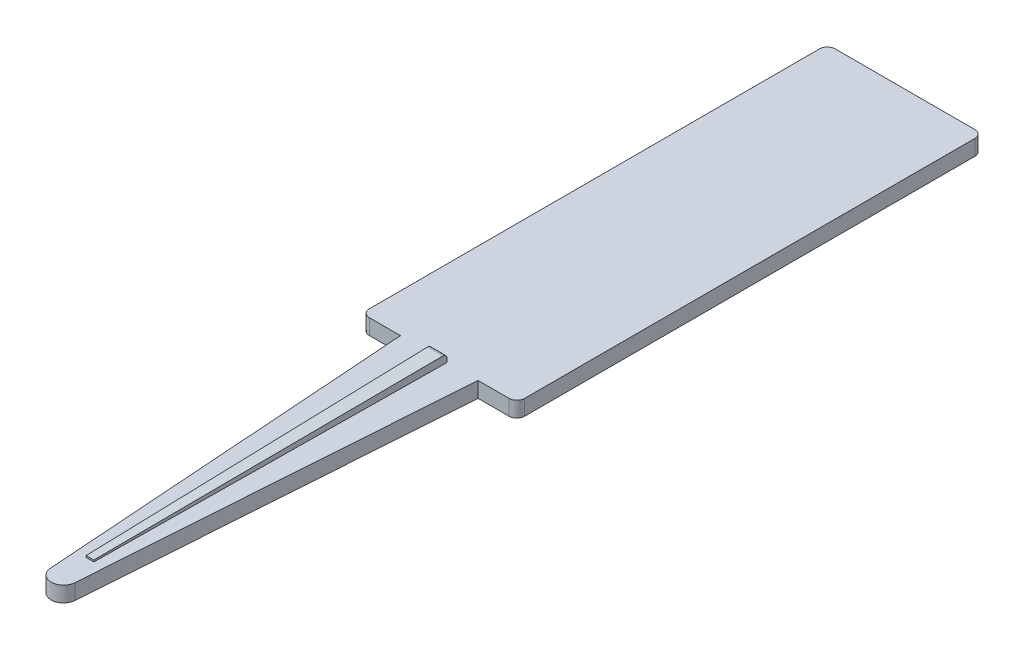
ISO-10303-21;
HEADER;
FILE_DESCRIPTION(('STEP AP214'),'2;1');
FILE_NAME('part.step','',(''),(''),'','','');
FILE_SCHEMA(('AUTOMOTIVE_DESIGN { 1 0 10303 214 1 1 1 1 }'));
ENDSEC;
DATA;
#1=APPLICATION_CONTEXT('core data for automotive mechanical design processes');
#2=APPLICATION_PROTOCOL_DEFINITION('international standard','automotive_design',2000,#1);
#3=PRODUCT_CONTEXT('',#1,'mechanical');
#4=PRODUCT('Part','Part','',(#3));
#5=PRODUCT_RELATED_PRODUCT_CATEGORY('part','',(#4));
#6=PRODUCT_DEFINITION_FORMATION('','',#4);
#7=PRODUCT_DEFINITION_CONTEXT('part definition',#1,'design');
#8=PRODUCT_DEFINITION('design','',#6,#7);
#9=PRODUCT_DEFINITION_SHAPE('','',#8);
#10=(LENGTH_UNIT() NAMED_UNIT(*) SI_UNIT(.MILLI.,.METRE.));
#11=(NAMED_UNIT(*) PLANE_ANGLE_UNIT() SI_UNIT($,.RADIAN.));
#12=(NAMED_UNIT(*) SI_UNIT($,.STERADIAN.) SOLID_ANGLE_UNIT());
#13=UNCERTAINTY_MEASURE_WITH_UNIT(LENGTH_MEASURE(1.E-05),#10,'distance_accuracy_value','');
#14=(GEOMETRIC_REPRESENTATION_CONTEXT(3) GLOBAL_UNCERTAINTY_ASSIGNED_CONTEXT((#13)) GLOBAL_UNIT_ASSIGNED_CONTEXT((#10,
#11,#12)) REPRESENTATION_CONTEXT('',''));
#15=CARTESIAN_POINT('',(0.,0.,0.));
#16=DIRECTION('',(0.,0.,1.));
#17=DIRECTION('',(1.,0.,0.));
#18=AXIS2_PLACEMENT_3D('',#15,#16,#17);
#19=CARTESIAN_POINT('',(11.,2.49119630351394,60.5));
#20=DIRECTION('',(-1.,0.,0.));
#21=DIRECTION('',(0.,0.,1.));
#22=AXIS2_PLACEMENT_3D('',#19,#20,#21);
#23=CYLINDRICAL_SURFACE('',#22,0.5);
#24=DIRECTION('',(1.,0.,0.));
#25=VECTOR('',#24,1.);
#26=CARTESIAN_POINT('',(11.,2.49119630351394,60.));
#27=LINE('',#26,#25);
#28=CARTESIAN_POINT('',(9.00000000000001,2.49119630351394,60.));
#29=VERTEX_POINT('',#28);
#30=CARTESIAN_POINT('',(11.,2.49119630351394,60.));
#31=VERTEX_POINT('',#30);
#32=EDGE_CURVE('E276',#29,#31,#27,.T.);
#33=ORIENTED_EDGE('',*,*,#32,.F.);
#34=CARTESIAN_POINT('',(9.00555555555557,2.49119630351394,60.5));
#35=DIRECTION('',(0.999938277319943,0.,-0.0111104253035552));
#36=DIRECTION('',(-0.0111104253035552,0.,-0.999938277319943));
#37=AXIS2_PLACEMENT_3D('',#34,#35,#36);
#38=ELLIPSE('',#37,0.500030863244991,0.5);
#39=CARTESIAN_POINT('',(9.00565251336911,2.99112015109213,60.5087262032186));
#40=VERTEX_POINT('',#39);
#41=EDGE_CURVE('E40',#40,#29,#38,.F.);
#42=ORIENTED_EDGE('',*,*,#41,.F.);
#43=DIRECTION('',(1.,0.,0.));
#44=VECTOR('',#43,1.);
#45=CARTESIAN_POINT('',(11.,2.99112015109213,60.5087262032186));
#46=LINE('',#45,#44);
#47=CARTESIAN_POINT('',(10.9943474866309,2.99112015109213,60.5087262032186));
#48=VERTEX_POINT('',#47);
#49=EDGE_CURVE('E283',#48,#40,#46,.F.);
#50=ORIENTED_EDGE('',*,*,#49,.F.);
#51=CARTESIAN_POINT('',(10.9944444444445,2.49119630351394,60.5));
#52=DIRECTION('',(-0.999938277319943,0.,-0.0111104253035547));
#53=DIRECTION('',(-0.0111104253035547,0.,0.999938277319943));
#54=AXIS2_PLACEMENT_3D('',#51,#52,#53);
#55=ELLIPSE('',#54,0.500030863244991,0.5);
#56=EDGE_CURVE('E11',#31,#48,#55,.F.);
#57=ORIENTED_EDGE('',*,*,#56,.F.);
#58=EDGE_LOOP('',(#33,#42,#50,#57));
#59=FACE_BOUND('',#58,.T.);
#60=ADVANCED_FACE('F33',(#59),#23,.T.);
#61=CARTESIAN_POINT('',(10.,2.,108.396074592786));
#62=DIRECTION('',(0.,1.,0.));
#63=DIRECTION('',(0.,0.,1.));
#64=AXIS2_PLACEMENT_3D('',#61,#62,#63);
#65=PLANE('',#64);
#66=DIRECTION('',(0.,0.,1.));
#67=VECTOR('',#66,1.);
#68=CARTESIAN_POINT('',(0.,2.,0.));
#69=LINE('',#68,#67);
#70=CARTESIAN_POINT('',(0.,2.,1.));
#71=VERTEX_POINT('',#70);
#72=CARTESIAN_POINT('',(0.,2.,59.));
#73=VERTEX_POINT('',#72);
#74=EDGE_CURVE('E186',#71,#73,#69,.T.);
#75=ORIENTED_EDGE('',*,*,#74,.T.);
#76=CARTESIAN_POINT('',(1.00000000000001,2.,59.));
#77=DIRECTION('',(0.,1.,0.));
#78=DIRECTION('',(0.,0.,1.));
#79=AXIS2_PLACEMENT_3D('',#76,#77,#78);
#80=CIRCLE('',#79,1.);
#81=CARTESIAN_POINT('',(1.00000000000001,2.,60.));
#82=VERTEX_POINT('',#81);
#83=EDGE_CURVE('E274',#73,#82,#80,.T.);
#84=ORIENTED_EDGE('',*,*,#83,.T.);
#85=DIRECTION('',(1.,0.,0.));
#86=VECTOR('',#85,1.);
#87=CARTESIAN_POINT('',(0.,2.,60.));
#88=LINE('',#87,#86);
#89=CARTESIAN_POINT('',(5.00000000000001,2.,60.));
#90=VERTEX_POINT('',#89);
#91=EDGE_CURVE('E189',#82,#90,#88,.T.);
#92=ORIENTED_EDGE('',*,*,#91,.T.);
#93=DIRECTION('',(0.0699196731432012,0.,0.997552624831165));
#94=VECTOR('',#93,1.);
#95=CARTESIAN_POINT('',(8.40000000000002,2.,108.508220533004));
#96=LINE('',#95,#94);
#97=CARTESIAN_POINT('',(8.40000000000002,2.,108.508220533004));
#98=VERTEX_POINT('',#97);
#99=EDGE_CURVE('E192',#90,#98,#96,.T.);
#100=ORIENTED_EDGE('',*,*,#99,.T.);
#101=CARTESIAN_POINT('',(10.,2.,108.396074592786));
#102=DIRECTION('',(0.,1.,0.));
#103=DIRECTION('',(0.,0.,1.));
#104=AXIS2_PLACEMENT_3D('',#101,#102,#103);
#105=CIRCLE('',#104,1.60392540721428);
#106=CARTESIAN_POINT('',(11.6,2.,108.508220533004));
#107=VERTEX_POINT('',#106);
#108=EDGE_CURVE('E194',#98,#107,#105,.T.);
#109=ORIENTED_EDGE('',*,*,#108,.T.);
#110=DIRECTION('',(0.0699196731432007,0.,-0.997552624831165));
#111=VECTOR('',#110,1.);
#112=CARTESIAN_POINT('',(11.6,2.,108.508220533004));
#113=LINE('',#112,#111);
#114=CARTESIAN_POINT('',(15.,2.,60.));
#115=VERTEX_POINT('',#114);
#116=EDGE_CURVE('E196',#107,#115,#113,.T.);
#117=ORIENTED_EDGE('',*,*,#116,.T.);
#118=DIRECTION('',(1.,0.,0.));
#119=VECTOR('',#118,1.);
#120=CARTESIAN_POINT('',(15.,2.,60.));
#121=LINE('',#120,#119);
#122=CARTESIAN_POINT('',(19.,2.,60.));
#123=VERTEX_POINT('',#122);
#124=EDGE_CURVE('E198',#115,#123,#121,.T.);
#125=ORIENTED_EDGE('',*,*,#124,.T.);
#126=CARTESIAN_POINT('',(19.,2.,59.));
#127=DIRECTION('',(0.,1.,0.));
#128=DIRECTION('',(0.,0.,1.));
#129=AXIS2_PLACEMENT_3D('',#126,#127,#128);
#130=CIRCLE('',#129,1.);
#131=CARTESIAN_POINT('',(20.,2.,59.));
#132=VERTEX_POINT('',#131);
#133=EDGE_CURVE('E254',#123,#132,#130,.T.);
#134=ORIENTED_EDGE('',*,*,#133,.T.);
#135=DIRECTION('',(0.,0.,-1.));
#136=VECTOR('',#135,1.);
#137=CARTESIAN_POINT('',(20.,2.,0.));
#138=LINE('',#137,#136);
#139=CARTESIAN_POINT('',(20.,2.,1.));
#140=VERTEX_POINT('',#139);
#141=EDGE_CURVE('E201',#132,#140,#138,.T.);
#142=ORIENTED_EDGE('',*,*,#141,.T.);
#143=CARTESIAN_POINT('',(19.,2.,1.));
#144=DIRECTION('',(0.,1.,0.));
#145=DIRECTION('',(0.,0.,1.));
#146=AXIS2_PLACEMENT_3D('',#143,#144,#145);
#147=CIRCLE('',#146,1.);
#148=CARTESIAN_POINT('',(19.,2.,0.));
#149=VERTEX_POINT('',#148);
#150=EDGE_CURVE('E262',#140,#149,#147,.T.);
#151=ORIENTED_EDGE('',*,*,#150,.T.);
#152=DIRECTION('',(-1.,0.,0.));
#153=VECTOR('',#152,1.);
#154=CARTESIAN_POINT('',(0.,2.,0.));
#155=LINE('',#154,#153);
#156=CARTESIAN_POINT('',(1.,2.,0.));
#157=VERTEX_POINT('',#156);
#158=EDGE_CURVE('E204',#149,#157,#155,.T.);
#159=ORIENTED_EDGE('',*,*,#158,.T.);
#160=CARTESIAN_POINT('',(1.,2.,1.));
#161=DIRECTION('',(0.,1.,0.));
#162=DIRECTION('',(0.,0.,1.));
#163=AXIS2_PLACEMENT_3D('',#160,#161,#162);
#164=CIRCLE('',#163,1.);
#165=EDGE_CURVE('E244',#157,#71,#164,.T.);
#166=ORIENTED_EDGE('',*,*,#165,.T.);
#167=EDGE_LOOP('',(#75,#84,#92,#100,#109,#117,#125,#134,#142,#151,#159,#166));
#168=FACE_BOUND('',#167,.T.);
#169=DIRECTION('',(1.,0.,0.));
#170=VECTOR('',#169,1.);
#171=CARTESIAN_POINT('',(10.5,2.,105.));
#172=LINE('',#171,#170);
#173=CARTESIAN_POINT('',(9.50000000000002,2.,105.));
#174=VERTEX_POINT('',#173);
#175=CARTESIAN_POINT('',(10.5,2.,105.));
#176=VERTEX_POINT('',#175);
#177=EDGE_CURVE('E154',#174,#176,#172,.T.);
#178=ORIENTED_EDGE('',*,*,#177,.F.);
#179=DIRECTION('',(0.0111104253035552,0.,0.999938277319943));
#180=VECTOR('',#179,1.);
#181=CARTESIAN_POINT('',(9.50000000000002,2.,105.));
#182=LINE('',#181,#180);
#183=CARTESIAN_POINT('',(9.00000000000001,2.,60.));
#184=VERTEX_POINT('',#183);
#185=EDGE_CURVE('E163',#184,#174,#182,.T.);
#186=ORIENTED_EDGE('',*,*,#185,.F.);
#187=DIRECTION('',(-1.,0.,0.));
#188=VECTOR('',#187,1.);
#189=CARTESIAN_POINT('',(11.,2.,60.));
#190=LINE('',#189,#188);
#191=CARTESIAN_POINT('',(11.,2.,60.));
#192=VERTEX_POINT('',#191);
#193=EDGE_CURVE('E176',#192,#184,#190,.T.);
#194=ORIENTED_EDGE('',*,*,#193,.F.);
#195=DIRECTION('',(0.0111104253035547,0.,-0.999938277319943));
#196=VECTOR('',#195,1.);
#197=CARTESIAN_POINT('',(11.,2.,60.));
#198=LINE('',#197,#196);
#199=EDGE_CURVE('E174',#176,#192,#198,.T.);
#200=ORIENTED_EDGE('',*,*,#199,.F.);
#201=EDGE_LOOP('',(#178,#186,#194,#200));
#202=FACE_BOUND('',#201,.T.);
#203=ADVANCED_FACE('F172',(#168,#202),#65,.T.);
#204=CARTESIAN_POINT('',(1.00000000000001,2.,59.));
#205=DIRECTION('',(0.,1.,0.));
#206=DIRECTION('',(0.,0.,1.));
#207=AXIS2_PLACEMENT_3D('',#204,#205,#206);
#208=CYLINDRICAL_SURFACE('',#207,1.);
#209=DIRECTION('',(0.,1.,0.));
#210=VECTOR('',#209,1.);
#211=CARTESIAN_POINT('',(0.,2.,59.));
#212=LINE('',#211,#210);
#213=CARTESIAN_POINT('',(0.,0.,59.));
#214=VERTEX_POINT('',#213);
#215=EDGE_CURVE('E266',#214,#73,#212,.T.);
#216=ORIENTED_EDGE('',*,*,#215,.F.);
#217=CARTESIAN_POINT('',(1.00000000000001,0.,59.));
#218=DIRECTION('',(0.,1.,0.));
#219=DIRECTION('',(0.,0.,1.));
#220=AXIS2_PLACEMENT_3D('',#217,#218,#219);
#221=CIRCLE('',#220,1.);
#222=CARTESIAN_POINT('',(1.00000000000001,0.,60.));
#223=VERTEX_POINT('',#222);
#224=EDGE_CURVE('E272',#223,#214,#221,.F.);
#225=ORIENTED_EDGE('',*,*,#224,.F.);
#226=DIRECTION('',(0.,1.,0.));
#227=VECTOR('',#226,1.);
#228=CARTESIAN_POINT('',(1.00000000000001,2.,60.));
#229=LINE('',#228,#227);
#230=EDGE_CURVE('E269',#82,#223,#229,.F.);
#231=ORIENTED_EDGE('',*,*,#230,.F.);
#232=ORIENTED_EDGE('',*,*,#83,.F.);
#233=EDGE_LOOP('',(#216,#225,#231,#232));
#234=FACE_BOUND('',#233,.T.);
#235=ADVANCED_FACE('F301',(#234),#208,.T.);
#236=CARTESIAN_POINT('',(19.,2.,1.));
#237=DIRECTION('',(0.,-1.,0.));
#238=DIRECTION('',(0.,0.,-1.));
#239=AXIS2_PLACEMENT_3D('',#236,#237,#238);
#240=CYLINDRICAL_SURFACE('',#239,1.);
#241=DIRECTION('',(0.,-1.,0.));
#242=VECTOR('',#241,1.);
#243=CARTESIAN_POINT('',(19.,2.,0.));
#244=LINE('',#243,#242);
#245=CARTESIAN_POINT('',(19.,0.,0.));
#246=VERTEX_POINT('',#245);
#247=EDGE_CURVE('E256',#149,#246,#244,.T.);
#248=ORIENTED_EDGE('',*,*,#247,.F.);
#249=ORIENTED_EDGE('',*,*,#150,.F.);
#250=DIRECTION('',(0.,-1.,0.));
#251=VECTOR('',#250,1.);
#252=CARTESIAN_POINT('',(20.,2.,1.));
#253=LINE('',#252,#251);
#254=CARTESIAN_POINT('',(20.,0.,1.));
#255=VERTEX_POINT('',#254);
#256=EDGE_CURVE('E259',#255,#140,#253,.F.);
#257=ORIENTED_EDGE('',*,*,#256,.F.);
#258=CARTESIAN_POINT('',(19.,0.,1.));
#259=DIRECTION('',(0.,1.,0.));
#260=DIRECTION('',(0.,0.,1.));
#261=AXIS2_PLACEMENT_3D('',#258,#259,#260);
#262=CIRCLE('',#261,1.);
#263=EDGE_CURVE('E264',#246,#255,#262,.F.);
#264=ORIENTED_EDGE('',*,*,#263,.F.);
#265=EDGE_LOOP('',(#248,#249,#257,#264));
#266=FACE_BOUND('',#265,.T.);
#267=ADVANCED_FACE('F309',(#266),#240,.T.);
#268=CARTESIAN_POINT('',(19.,2.,59.));
#269=DIRECTION('',(0.,1.,0.));
#270=DIRECTION('',(0.,0.,1.));
#271=AXIS2_PLACEMENT_3D('',#268,#269,#270);
#272=CYLINDRICAL_SURFACE('',#271,1.);
#273=DIRECTION('',(0.,1.,0.));
#274=VECTOR('',#273,1.);
#275=CARTESIAN_POINT('',(19.,2.,60.));
#276=LINE('',#275,#274);
#277=CARTESIAN_POINT('',(19.,0.,60.));
#278=VERTEX_POINT('',#277);
#279=EDGE_CURVE('E246',#278,#123,#276,.T.);
#280=ORIENTED_EDGE('',*,*,#279,.F.);
#281=CARTESIAN_POINT('',(19.,0.,59.));
#282=DIRECTION('',(0.,1.,0.));
#283=DIRECTION('',(0.,0.,1.));
#284=AXIS2_PLACEMENT_3D('',#281,#282,#283);
#285=CIRCLE('',#284,1.);
#286=CARTESIAN_POINT('',(20.,0.,59.));
#287=VERTEX_POINT('',#286);
#288=EDGE_CURVE('E252',#287,#278,#285,.F.);
#289=ORIENTED_EDGE('',*,*,#288,.F.);
#290=DIRECTION('',(0.,1.,0.));
#291=VECTOR('',#290,1.);
#292=CARTESIAN_POINT('',(20.,2.,59.));
#293=LINE('',#292,#291);
#294=EDGE_CURVE('E249',#132,#287,#293,.F.);
#295=ORIENTED_EDGE('',*,*,#294,.F.);
#296=ORIENTED_EDGE('',*,*,#133,.F.);
#297=EDGE_LOOP('',(#280,#289,#295,#296));
#298=FACE_BOUND('',#297,.T.);
#299=ADVANCED_FACE('F353',(#298),#272,.T.);
#300=CARTESIAN_POINT('',(1.,2.,1.));
#301=DIRECTION('',(0.,1.,0.));
#302=DIRECTION('',(0.,0.,1.));
#303=AXIS2_PLACEMENT_3D('',#300,#301,#302);
#304=CYLINDRICAL_SURFACE('',#303,1.);
#305=DIRECTION('',(0.,1.,0.));
#306=VECTOR('',#305,1.);
#307=CARTESIAN_POINT('',(1.,2.,0.));
#308=LINE('',#307,#306);
#309=CARTESIAN_POINT('',(1.,0.,0.));
#310=VERTEX_POINT('',#309);
#311=EDGE_CURVE('E235',#310,#157,#308,.T.);
#312=ORIENTED_EDGE('',*,*,#311,.F.);
#313=CARTESIAN_POINT('',(1.,0.,1.));
#314=DIRECTION('',(0.,1.,0.));
#315=DIRECTION('',(0.,0.,1.));
#316=AXIS2_PLACEMENT_3D('',#313,#314,#315);
#317=CIRCLE('',#316,1.);
#318=CARTESIAN_POINT('',(0.,0.,1.));
#319=VERTEX_POINT('',#318);
#320=EDGE_CURVE('E241',#319,#310,#317,.F.);
#321=ORIENTED_EDGE('',*,*,#320,.F.);
#322=DIRECTION('',(0.,1.,0.));
#323=VECTOR('',#322,1.);
#324=CARTESIAN_POINT('',(0.,2.,1.));
#325=LINE('',#324,#323);
#326=EDGE_CURVE('E238',#71,#319,#325,.F.);
#327=ORIENTED_EDGE('',*,*,#326,.F.);
#328=ORIENTED_EDGE('',*,*,#165,.F.);
#329=EDGE_LOOP('',(#312,#321,#327,#328));
#330=FACE_BOUND('',#329,.T.);
#331=ADVANCED_FACE('F349',(#330),#304,.T.);
#332=CARTESIAN_POINT('',(0.,2.,0.));
#333=DIRECTION('',(1.,0.,0.));
#334=DIRECTION('',(0.,0.,-1.));
#335=AXIS2_PLACEMENT_3D('',#332,#333,#334);
#336=PLANE('',#335);
#337=DIRECTION('',(0.,0.,1.));
#338=VECTOR('',#337,1.);
#339=CARTESIAN_POINT('',(0.,0.,0.));
#340=LINE('',#339,#338);
#341=EDGE_CURVE('E159',#319,#214,#340,.T.);
#342=ORIENTED_EDGE('',*,*,#341,.T.);
#343=ORIENTED_EDGE('',*,*,#215,.T.);
#344=ORIENTED_EDGE('',*,*,#74,.F.);
#345=ORIENTED_EDGE('',*,*,#326,.T.);
#346=EDGE_LOOP('',(#342,#343,#344,#345));
#347=FACE_BOUND('',#346,.T.);
#348=ADVANCED_FACE('F345',(#347),#336,.F.);
#349=CARTESIAN_POINT('',(0.,2.,60.));
#350=DIRECTION('',(0.,0.,-1.));
#351=DIRECTION('',(-1.,0.,0.));
#352=AXIS2_PLACEMENT_3D('',#349,#350,#351);
#353=PLANE('',#352);
#354=ORIENTED_EDGE('',*,*,#91,.F.);
#355=ORIENTED_EDGE('',*,*,#230,.T.);
#356=DIRECTION('',(1.,0.,0.));
#357=VECTOR('',#356,1.);
#358=CARTESIAN_POINT('',(0.,0.,60.));
#359=LINE('',#358,#357);
#360=CARTESIAN_POINT('',(5.00000000000001,0.,60.));
#361=VERTEX_POINT('',#360);
#362=EDGE_CURVE('E209',#223,#361,#359,.T.);
#363=ORIENTED_EDGE('',*,*,#362,.T.);
#364=DIRECTION('',(0.,-1.,0.));
#365=VECTOR('',#364,1.);
#366=CARTESIAN_POINT('',(5.00000000000001,2.,60.));
#367=LINE('',#366,#365);
#368=EDGE_CURVE('E232',#90,#361,#367,.T.);
#369=ORIENTED_EDGE('',*,*,#368,.F.);
#370=EDGE_LOOP('',(#354,#355,#363,#369));
#371=FACE_BOUND('',#370,.T.);
#372=ADVANCED_FACE('F341',(#371),#353,.F.);
#373=CARTESIAN_POINT('',(8.40000000000002,2.,108.508220533004));
#374=DIRECTION('',(0.997552624831166,0.,-0.0699196731432012));
#375=DIRECTION('',(-0.0699196731432012,0.,-0.997552624831166));
#376=AXIS2_PLACEMENT_3D('',#373,#374,#375);
#377=PLANE('',#376);
#378=DIRECTION('',(0.0699196731432012,0.,0.997552624831165));
#379=VECTOR('',#378,1.);
#380=CARTESIAN_POINT('',(8.40000000000002,0.,108.508220533004));
#381=LINE('',#380,#379);
#382=CARTESIAN_POINT('',(8.40000000000002,0.,108.508220533004));
#383=VERTEX_POINT('',#382);
#384=EDGE_CURVE('E211',#361,#383,#381,.T.);
#385=ORIENTED_EDGE('',*,*,#384,.T.);
#386=DIRECTION('',(0.,-1.,0.));
#387=VECTOR('',#386,1.);
#388=CARTESIAN_POINT('',(8.40000000000002,2.,108.508220533004));
#389=LINE('',#388,#387);
#390=EDGE_CURVE('E229',#98,#383,#389,.T.);
#391=ORIENTED_EDGE('',*,*,#390,.F.);
#392=ORIENTED_EDGE('',*,*,#99,.F.);
#393=ORIENTED_EDGE('',*,*,#368,.T.);
#394=EDGE_LOOP('',(#385,#391,#392,#393));
#395=FACE_BOUND('',#394,.T.);
#396=ADVANCED_FACE('F337',(#395),#377,.F.);
#397=CARTESIAN_POINT('',(10.,2.,108.396074592786));
#398=DIRECTION('',(0.,-1.,0.));
#399=DIRECTION('',(0.,0.,-1.));
#400=AXIS2_PLACEMENT_3D('',#397,#398,#399);
#401=CYLINDRICAL_SURFACE('',#400,1.60392540721428);
#402=CARTESIAN_POINT('',(10.,0.,108.396074592786));
#403=DIRECTION('',(0.,1.,0.));
#404=DIRECTION('',(0.,0.,1.));
#405=AXIS2_PLACEMENT_3D('',#402,#403,#404);
#406=CIRCLE('',#405,1.60392540721428);
#407=CARTESIAN_POINT('',(11.6,0.,108.508220533004));
#408=VERTEX_POINT('',#407);
#409=EDGE_CURVE('E213',#383,#408,#406,.T.);
#410=ORIENTED_EDGE('',*,*,#409,.T.);
#411=DIRECTION('',(0.,-1.,0.));
#412=VECTOR('',#411,1.);
#413=CARTESIAN_POINT('',(11.6,2.,108.508220533004));
#414=LINE('',#413,#412);
#415=EDGE_CURVE('E226',#107,#408,#414,.T.);
#416=ORIENTED_EDGE('',*,*,#415,.F.);
#417=ORIENTED_EDGE('',*,*,#108,.F.);
#418=ORIENTED_EDGE('',*,*,#390,.T.);
#419=EDGE_LOOP('',(#410,#416,#417,#418));
#420=FACE_BOUND('',#419,.T.);
#421=ADVANCED_FACE('F333',(#420),#401,.T.);
#422=CARTESIAN_POINT('',(11.6,2.,108.508220533004));
#423=DIRECTION('',(-0.997552624831166,0.,-0.0699196731432007));
#424=DIRECTION('',(-0.0699196731432007,0.,0.997552624831166));
#425=AXIS2_PLACEMENT_3D('',#422,#423,#424);
#426=PLANE('',#425);
#427=DIRECTION('',(0.0699196731432007,0.,-0.997552624831165));
#428=VECTOR('',#427,1.);
#429=CARTESIAN_POINT('',(11.6,0.,108.508220533004));
#430=LINE('',#429,#428);
#431=CARTESIAN_POINT('',(15.,0.,60.));
#432=VERTEX_POINT('',#431);
#433=EDGE_CURVE('E215',#408,#432,#430,.T.);
#434=ORIENTED_EDGE('',*,*,#433,.T.);
#435=DIRECTION('',(0.,-1.,0.));
#436=VECTOR('',#435,1.);
#437=CARTESIAN_POINT('',(15.,2.,60.));
#438=LINE('',#437,#436);
#439=EDGE_CURVE('E206',#115,#432,#438,.T.);
#440=ORIENTED_EDGE('',*,*,#439,.F.);
#441=ORIENTED_EDGE('',*,*,#116,.F.);
#442=ORIENTED_EDGE('',*,*,#415,.T.);
#443=EDGE_LOOP('',(#434,#440,#441,#442));
#444=FACE_BOUND('',#443,.T.);
#445=ADVANCED_FACE('F329',(#444),#426,.F.);
#446=CARTESIAN_POINT('',(15.,2.,60.));
#447=DIRECTION('',(0.,0.,-1.));
#448=DIRECTION('',(-1.,0.,0.));
#449=AXIS2_PLACEMENT_3D('',#446,#447,#448);
#450=PLANE('',#449);
#451=DIRECTION('',(1.,0.,0.));
#452=VECTOR('',#451,1.);
#453=CARTESIAN_POINT('',(15.,0.,60.));
#454=LINE('',#453,#452);
#455=EDGE_CURVE('E217',#432,#278,#454,.T.);
#456=ORIENTED_EDGE('',*,*,#455,.T.);
#457=ORIENTED_EDGE('',*,*,#279,.T.);
#458=ORIENTED_EDGE('',*,*,#124,.F.);
#459=ORIENTED_EDGE('',*,*,#439,.T.);
#460=EDGE_LOOP('',(#456,#457,#458,#459));
#461=FACE_BOUND('',#460,.T.);
#462=ADVANCED_FACE('F325',(#461),#450,.F.);
#463=CARTESIAN_POINT('',(20.,2.,0.));
#464=DIRECTION('',(-1.,0.,0.));
#465=DIRECTION('',(0.,0.,1.));
#466=AXIS2_PLACEMENT_3D('',#463,#464,#465);
#467=PLANE('',#466);
#468=DIRECTION('',(0.,0.,-1.));
#469=VECTOR('',#468,1.);
#470=CARTESIAN_POINT('',(20.,0.,0.));
#471=LINE('',#470,#469);
#472=EDGE_CURVE('E220',#287,#255,#471,.T.);
#473=ORIENTED_EDGE('',*,*,#472,.T.);
#474=ORIENTED_EDGE('',*,*,#256,.T.);
#475=ORIENTED_EDGE('',*,*,#141,.F.);
#476=ORIENTED_EDGE('',*,*,#294,.T.);
#477=EDGE_LOOP('',(#473,#474,#475,#476));
#478=FACE_BOUND('',#477,.T.);
#479=ADVANCED_FACE('F321',(#478),#467,.F.);
#480=CARTESIAN_POINT('',(0.,2.,0.));
#481=DIRECTION('',(0.,0.,1.));
#482=DIRECTION('',(1.,0.,0.));
#483=AXIS2_PLACEMENT_3D('',#480,#481,#482);
#484=PLANE('',#483);
#485=ORIENTED_EDGE('',*,*,#158,.F.);
#486=ORIENTED_EDGE('',*,*,#247,.T.);
#487=DIRECTION('',(-1.,0.,0.));
#488=VECTOR('',#487,1.);
#489=CARTESIAN_POINT('',(0.,0.,0.));
#490=LINE('',#489,#488);
#491=EDGE_CURVE('E190',#246,#310,#490,.T.);
#492=ORIENTED_EDGE('',*,*,#491,.T.);
#493=ORIENTED_EDGE('',*,*,#311,.T.);
#494=EDGE_LOOP('',(#485,#486,#492,#493));
#495=FACE_BOUND('',#494,.T.);
#496=ADVANCED_FACE('F317',(#495),#484,.F.);
#497=CARTESIAN_POINT('',(10.,0.,108.396074592786));
#498=DIRECTION('',(0.,1.,0.));
#499=DIRECTION('',(0.,0.,1.));
#500=AXIS2_PLACEMENT_3D('',#497,#498,#499);
#501=PLANE('',#500);
#502=ORIENTED_EDGE('',*,*,#362,.F.);
#503=ORIENTED_EDGE('',*,*,#224,.T.);
#504=ORIENTED_EDGE('',*,*,#341,.F.);
#505=ORIENTED_EDGE('',*,*,#320,.T.);
#506=ORIENTED_EDGE('',*,*,#491,.F.);
#507=ORIENTED_EDGE('',*,*,#263,.T.);
#508=ORIENTED_EDGE('',*,*,#472,.F.);
#509=ORIENTED_EDGE('',*,*,#288,.T.);
#510=ORIENTED_EDGE('',*,*,#455,.F.);
#511=ORIENTED_EDGE('',*,*,#433,.F.);
#512=ORIENTED_EDGE('',*,*,#409,.F.);
#513=ORIENTED_EDGE('',*,*,#384,.F.);
#514=EDGE_LOOP('',(#502,#503,#504,#505,#506,#507,#508,#509,#510,#511,#512,#513));
#515=FACE_BOUND('',#514,.T.);
#516=ADVANCED_FACE('F314',(#515),#501,.F.);
#517=CARTESIAN_POINT('',(9.50000000000002,3.,105.));
#518=DIRECTION('',(0.999938277319943,0.,-0.0111104253035552));
#519=DIRECTION('',(-0.0111104253035552,0.,-0.999938277319943));
#520=AXIS2_PLACEMENT_3D('',#517,#518,#519);
#521=PLANE('',#520);
#522=DIRECTION('',(0.0111087333408035,-0.0174513295560578,0.999786000672288));
#523=VECTOR('',#522,1.);
#524=CARTESIAN_POINT('',(9.49984772554839,2.21476129466983,104.986295299353));
#525=LINE('',#524,#523);
#526=CARTESIAN_POINT('',(9.50000000000002,2.21452207823021,105.));
#527=VERTEX_POINT('',#526);
#528=EDGE_CURVE('E180',#40,#527,#525,.T.);
#529=ORIENTED_EDGE('',*,*,#528,.F.);
#530=ORIENTED_EDGE('',*,*,#41,.T.);
#531=DIRECTION('',(0.,-1.,0.));
#532=VECTOR('',#531,1.);
#533=CARTESIAN_POINT('',(9.00000000000001,3.,60.));
#534=LINE('',#533,#532);
#535=EDGE_CURVE('E166',#29,#184,#534,.T.);
#536=ORIENTED_EDGE('',*,*,#535,.T.);
#537=ORIENTED_EDGE('',*,*,#185,.T.);
#538=DIRECTION('',(0.,-1.,0.));
#539=VECTOR('',#538,1.);
#540=CARTESIAN_POINT('',(9.50000000000002,3.,105.));
#541=LINE('',#540,#539);
#542=EDGE_CURVE('E149',#527,#174,#541,.T.);
#543=ORIENTED_EDGE('',*,*,#542,.F.);
#544=EDGE_LOOP('',(#529,#530,#536,#537,#543));
#545=FACE_BOUND('',#544,.T.);
#546=ADVANCED_FACE('F164',(#545),#521,.F.);
#547=CARTESIAN_POINT('',(10.5,3.,105.));
#548=DIRECTION('',(0.,0.,-1.));
#549=DIRECTION('',(-1.,0.,0.));
#550=AXIS2_PLACEMENT_3D('',#547,#548,#549);
#551=PLANE('',#550);
#552=ORIENTED_EDGE('',*,*,#177,.T.);
#553=DIRECTION('',(0.,-1.,0.));
#554=VECTOR('',#553,1.);
#555=CARTESIAN_POINT('',(10.5,3.,105.));
#556=LINE('',#555,#554);
#557=CARTESIAN_POINT('',(10.5,2.21452207823021,105.));
#558=VERTEX_POINT('',#557);
#559=EDGE_CURVE('E160',#558,#176,#556,.T.);
#560=ORIENTED_EDGE('',*,*,#559,.F.);
#561=DIRECTION('',(1.,0.,0.));
#562=VECTOR('',#561,1.);
#563=CARTESIAN_POINT('',(10.5,2.21452207823021,105.));
#564=LINE('',#563,#562);
#565=EDGE_CURVE('E156',#527,#558,#564,.T.);
#566=ORIENTED_EDGE('',*,*,#565,.F.);
#567=ORIENTED_EDGE('',*,*,#542,.T.);
#568=EDGE_LOOP('',(#552,#560,#566,#567));
#569=FACE_BOUND('',#568,.T.);
#570=ADVANCED_FACE('F151',(#569),#551,.F.);
#571=CARTESIAN_POINT('',(11.,3.,60.));
#572=DIRECTION('',(-0.999938277319943,0.,-0.0111104253035547));
#573=DIRECTION('',(-0.0111104253035547,0.,0.999938277319943));
#574=AXIS2_PLACEMENT_3D('',#571,#572,#573);
#575=PLANE('',#574);
#576=DIRECTION('',(0.,-1.,0.));
#577=VECTOR('',#576,1.);
#578=CARTESIAN_POINT('',(11.,3.,60.));
#579=LINE('',#578,#577);
#580=EDGE_CURVE('E182',#31,#192,#579,.T.);
#581=ORIENTED_EDGE('',*,*,#580,.F.);
#582=ORIENTED_EDGE('',*,*,#56,.T.);
#583=DIRECTION('',(0.0111087333408029,0.0174513295560578,-0.999786000672288));
#584=VECTOR('',#583,1.);
#585=CARTESIAN_POINT('',(11.,3.,60.));
#586=LINE('',#585,#584);
#587=EDGE_CURVE('E183',#558,#48,#586,.T.);
#588=ORIENTED_EDGE('',*,*,#587,.F.);
#589=ORIENTED_EDGE('',*,*,#559,.T.);
#590=ORIENTED_EDGE('',*,*,#199,.T.);
#591=EDGE_LOOP('',(#581,#582,#588,#589,#590));
#592=FACE_BOUND('',#591,.T.);
#593=ADVANCED_FACE('F286',(#592),#575,.F.);
#594=CARTESIAN_POINT('',(11.,3.,60.));
#595=DIRECTION('',(0.,0.,1.));
#596=DIRECTION('',(1.,0.,0.));
#597=AXIS2_PLACEMENT_3D('',#594,#595,#596);
#598=PLANE('',#597);
#599=ORIENTED_EDGE('',*,*,#535,.F.);
#600=ORIENTED_EDGE('',*,*,#32,.T.);
#601=ORIENTED_EDGE('',*,*,#580,.T.);
#602=ORIENTED_EDGE('',*,*,#193,.T.);
#603=EDGE_LOOP('',(#599,#600,#601,#602));
#604=FACE_BOUND('',#603,.T.);
#605=ADVANCED_FACE('F285',(#604),#598,.F.);
#606=CARTESIAN_POINT('',(11.,3.,60.));
#607=DIRECTION('',(0.,0.999847695156391,0.0174524064372835));
#608=DIRECTION('',(0.,-0.0174524064372835,0.999847695156391));
#609=AXIS2_PLACEMENT_3D('',#606,#607,#608);
#610=PLANE('',#609);
#611=ORIENTED_EDGE('',*,*,#587,.T.);
#612=ORIENTED_EDGE('',*,*,#49,.T.);
#613=ORIENTED_EDGE('',*,*,#528,.T.);
#614=ORIENTED_EDGE('',*,*,#565,.T.);
#615=EDGE_LOOP('',(#611,#612,#613,#614));
#616=FACE_BOUND('',#615,.T.);
#617=ADVANCED_FACE('F288',(#616),#610,.T.);
#618=CLOSED_SHELL('',(#60,#203,#235,#267,#299,#331,#348,#372,#396,#421,#445,#462,#479,#496,#516,
#546,#570,#593,#605,#617));
#619=MANIFOLD_SOLID_BREP('B2',#618);
#620=ADVANCED_BREP_SHAPE_REPRESENTATION('',(#18,#619),#14);
#621=SHAPE_DEFINITION_REPRESENTATION(#9,#620);
ENDSEC;
END-ISO-10303-21;
